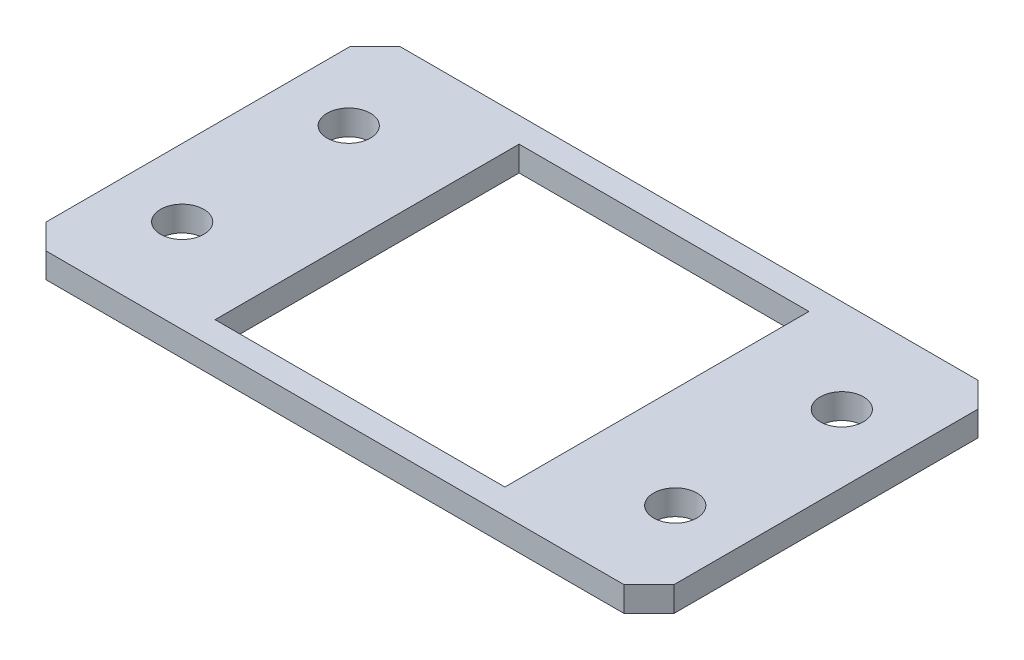
ISO-10303-21;
HEADER;
FILE_DESCRIPTION(('STEP AP214'),'2;1');
FILE_NAME('part.step','',(''),(''),'','','');
FILE_SCHEMA(('AUTOMOTIVE_DESIGN { 1 0 10303 214 1 1 1 1 }'));
ENDSEC;
DATA;
#1=APPLICATION_CONTEXT('core data for automotive mechanical design processes');
#2=APPLICATION_PROTOCOL_DEFINITION('international standard','automotive_design',2000,#1);
#3=PRODUCT_CONTEXT('',#1,'mechanical');
#4=PRODUCT('Part','Part','',(#3));
#5=PRODUCT_RELATED_PRODUCT_CATEGORY('part','',(#4));
#6=PRODUCT_DEFINITION_FORMATION('','',#4);
#7=PRODUCT_DEFINITION_CONTEXT('part definition',#1,'design');
#8=PRODUCT_DEFINITION('design','',#6,#7);
#9=PRODUCT_DEFINITION_SHAPE('','',#8);
#10=(LENGTH_UNIT() NAMED_UNIT(*) SI_UNIT(.MILLI.,.METRE.));
#11=(NAMED_UNIT(*) PLANE_ANGLE_UNIT() SI_UNIT($,.RADIAN.));
#12=(NAMED_UNIT(*) SI_UNIT($,.STERADIAN.) SOLID_ANGLE_UNIT());
#13=UNCERTAINTY_MEASURE_WITH_UNIT(LENGTH_MEASURE(1.E-05),#10,'distance_accuracy_value','');
#14=(GEOMETRIC_REPRESENTATION_CONTEXT(3) GLOBAL_UNCERTAINTY_ASSIGNED_CONTEXT((#13)) GLOBAL_UNIT_ASSIGNED_CONTEXT((#10,
#11,#12)) REPRESENTATION_CONTEXT('',''));
#15=CARTESIAN_POINT('',(0.,0.,0.));
#16=DIRECTION('',(0.,0.,1.));
#17=DIRECTION('',(1.,0.,0.));
#18=AXIS2_PLACEMENT_3D('',#15,#16,#17);
#19=CARTESIAN_POINT('',(0.,3.,18.4656202867812));
#20=DIRECTION('',(0.,0.,-1.));
#21=DIRECTION('',(-1.,0.,0.));
#22=AXIS2_PLACEMENT_3D('',#19,#20,#21);
#23=PLANE('',#22);
#24=DIRECTION('',(1.,0.,0.));
#25=VECTOR('',#24,1.);
#26=CARTESIAN_POINT('',(0.,0.,18.4656202867812));
#27=LINE('',#26,#25);
#28=CARTESIAN_POINT('',(-15.7752157261213,0.,18.4656202867812));
#29=VERTEX_POINT('',#28);
#30=CARTESIAN_POINT('',(19.0247842738787,0.,18.4656202867812));
#31=VERTEX_POINT('',#30);
#32=EDGE_CURVE('E144',#29,#31,#27,.T.);
#33=ORIENTED_EDGE('',*,*,#32,.F.);
#34=DIRECTION('',(0.,-1.,0.));
#35=VECTOR('',#34,1.);
#36=CARTESIAN_POINT('',(-15.7752157261213,3.,18.4656202867812));
#37=LINE('',#36,#35);
#38=CARTESIAN_POINT('',(-15.7752157261213,3.,18.4656202867812));
#39=VERTEX_POINT('',#38);
#40=EDGE_CURVE('E138',#39,#29,#37,.T.);
#41=ORIENTED_EDGE('',*,*,#40,.F.);
#42=DIRECTION('',(1.,0.,0.));
#43=VECTOR('',#42,1.);
#44=CARTESIAN_POINT('',(0.,3.,18.4656202867812));
#45=LINE('',#44,#43);
#46=CARTESIAN_POINT('',(19.0247842738787,3.,18.4656202867812));
#47=VERTEX_POINT('',#46);
#48=EDGE_CURVE('E141',#39,#47,#45,.T.);
#49=ORIENTED_EDGE('',*,*,#48,.T.);
#50=DIRECTION('',(0.,-1.,0.));
#51=VECTOR('',#50,1.);
#52=CARTESIAN_POINT('',(19.0247842738787,3.,18.4656202867812));
#53=LINE('',#52,#51);
#54=EDGE_CURVE('E176',#47,#31,#53,.T.);
#55=ORIENTED_EDGE('',*,*,#54,.T.);
#56=EDGE_LOOP('',(#33,#41,#49,#55));
#57=FACE_BOUND('',#56,.T.);
#58=ADVANCED_FACE('F46',(#57),#23,.T.);
#59=CARTESIAN_POINT('',(-15.7752157261213,3.,0.));
#60=DIRECTION('',(-1.,0.,0.));
#61=DIRECTION('',(0.,0.,1.));
#62=AXIS2_PLACEMENT_3D('',#59,#60,#61);
#63=PLANE('',#62);
#64=DIRECTION('',(0.,0.,-1.));
#65=VECTOR('',#64,1.);
#66=CARTESIAN_POINT('',(-15.7752157261213,0.,0.));
#67=LINE('',#66,#65);
#68=CARTESIAN_POINT('',(-15.7752157261213,0.,-18.0381411859944));
#69=VERTEX_POINT('',#68);
#70=EDGE_CURVE('E211',#29,#69,#67,.T.);
#71=ORIENTED_EDGE('',*,*,#70,.T.);
#72=DIRECTION('',(0.,-1.,0.));
#73=VECTOR('',#72,1.);
#74=CARTESIAN_POINT('',(-15.7752157261213,3.,-18.0381411859944));
#75=LINE('',#74,#73);
#76=CARTESIAN_POINT('',(-15.7752157261213,3.,-18.0381411859944));
#77=VERTEX_POINT('',#76);
#78=EDGE_CURVE('E150',#77,#69,#75,.T.);
#79=ORIENTED_EDGE('',*,*,#78,.F.);
#80=DIRECTION('',(0.,0.,-1.));
#81=VECTOR('',#80,1.);
#82=CARTESIAN_POINT('',(-15.7752157261213,3.,0.));
#83=LINE('',#82,#81);
#84=EDGE_CURVE('E154',#39,#77,#83,.T.);
#85=ORIENTED_EDGE('',*,*,#84,.F.);
#86=ORIENTED_EDGE('',*,*,#40,.T.);
#87=EDGE_LOOP('',(#71,#79,#85,#86));
#88=FACE_BOUND('',#87,.T.);
#89=ADVANCED_FACE('F155',(#88),#63,.F.);
#90=CARTESIAN_POINT('',(0.,3.,-18.0381411859944));
#91=DIRECTION('',(0.,0.,-1.));
#92=DIRECTION('',(-1.,0.,0.));
#93=AXIS2_PLACEMENT_3D('',#90,#91,#92);
#94=PLANE('',#93);
#95=DIRECTION('',(1.,0.,0.));
#96=VECTOR('',#95,1.);
#97=CARTESIAN_POINT('',(0.,0.,-18.0381411859944));
#98=LINE('',#97,#96);
#99=CARTESIAN_POINT('',(19.0247842738787,0.,-18.0381411859944));
#100=VERTEX_POINT('',#99);
#101=EDGE_CURVE('E214',#69,#100,#98,.T.);
#102=ORIENTED_EDGE('',*,*,#101,.T.);
#103=DIRECTION('',(0.,-1.,0.));
#104=VECTOR('',#103,1.);
#105=CARTESIAN_POINT('',(19.0247842738787,3.,-18.0381411859944));
#106=LINE('',#105,#104);
#107=CARTESIAN_POINT('',(19.0247842738787,3.,-18.0381411859944));
#108=VERTEX_POINT('',#107);
#109=EDGE_CURVE('E225',#108,#100,#106,.T.);
#110=ORIENTED_EDGE('',*,*,#109,.F.);
#111=DIRECTION('',(1.,0.,0.));
#112=VECTOR('',#111,1.);
#113=CARTESIAN_POINT('',(0.,3.,-18.0381411859944));
#114=LINE('',#113,#112);
#115=EDGE_CURVE('E159',#77,#108,#114,.T.);
#116=ORIENTED_EDGE('',*,*,#115,.F.);
#117=ORIENTED_EDGE('',*,*,#78,.T.);
#118=EDGE_LOOP('',(#102,#110,#116,#117));
#119=FACE_BOUND('',#118,.T.);
#120=ADVANCED_FACE('F362',(#119),#94,.F.);
#121=CARTESIAN_POINT('',(0.,3.,21.4656202867812));
#122=DIRECTION('',(0.,0.,-1.));
#123=DIRECTION('',(-1.,0.,0.));
#124=AXIS2_PLACEMENT_3D('',#121,#122,#123);
#125=PLANE('',#124);
#126=DIRECTION('',(1.,0.,0.));
#127=VECTOR('',#126,1.);
#128=CARTESIAN_POINT('',(0.,0.,21.4656202867812));
#129=LINE('',#128,#127);
#130=CARTESIAN_POINT('',(-33.0752157261213,0.,21.4656202867812));
#131=VERTEX_POINT('',#130);
#132=CARTESIAN_POINT('',(36.3247842738787,0.,21.4656202867812));
#133=VERTEX_POINT('',#132);
#134=EDGE_CURVE('E193',#131,#133,#129,.T.);
#135=ORIENTED_EDGE('',*,*,#134,.T.);
#136=DIRECTION('',(0.,1.,0.));
#137=VECTOR('',#136,1.);
#138=CARTESIAN_POINT('',(36.3247842738787,3.,21.4656202867812));
#139=LINE('',#138,#137);
#140=CARTESIAN_POINT('',(36.3247842738787,3.,21.4656202867812));
#141=VERTEX_POINT('',#140);
#142=EDGE_CURVE('E270',#133,#141,#139,.T.);
#143=ORIENTED_EDGE('',*,*,#142,.T.);
#144=DIRECTION('',(1.,0.,0.));
#145=VECTOR('',#144,1.);
#146=CARTESIAN_POINT('',(0.,3.,21.4656202867812));
#147=LINE('',#146,#145);
#148=CARTESIAN_POINT('',(-33.0752157261213,3.,21.4656202867812));
#149=VERTEX_POINT('',#148);
#150=EDGE_CURVE('E278',#149,#141,#147,.T.);
#151=ORIENTED_EDGE('',*,*,#150,.F.);
#152=DIRECTION('',(0.,-1.,0.));
#153=VECTOR('',#152,1.);
#154=CARTESIAN_POINT('',(-33.0752157261213,0.,21.4656202867812));
#155=LINE('',#154,#153);
#156=EDGE_CURVE('E266',#149,#131,#155,.T.);
#157=ORIENTED_EDGE('',*,*,#156,.T.);
#158=EDGE_LOOP('',(#135,#143,#151,#157));
#159=FACE_BOUND('',#158,.T.);
#160=ADVANCED_FACE('F277',(#159),#125,.F.);
#161=CARTESIAN_POINT('',(39.3247842738788,3.,0.));
#162=DIRECTION('',(-1.,0.,0.));
#163=DIRECTION('',(0.,0.,1.));
#164=AXIS2_PLACEMENT_3D('',#161,#162,#163);
#165=PLANE('',#164);
#166=DIRECTION('',(0.,0.,-1.));
#167=VECTOR('',#166,1.);
#168=CARTESIAN_POINT('',(39.3247842738788,0.,0.));
#169=LINE('',#168,#167);
#170=CARTESIAN_POINT('',(39.3247842738788,0.,18.4656202867812));
#171=VERTEX_POINT('',#170);
#172=CARTESIAN_POINT('',(39.3247842738788,0.,-18.0381411859944));
#173=VERTEX_POINT('',#172);
#174=EDGE_CURVE('E197',#171,#173,#169,.T.);
#175=ORIENTED_EDGE('',*,*,#174,.T.);
#176=DIRECTION('',(0.,1.,0.));
#177=VECTOR('',#176,1.);
#178=CARTESIAN_POINT('',(39.3247842738788,3.,-18.0381411859944));
#179=LINE('',#178,#177);
#180=CARTESIAN_POINT('',(39.3247842738788,3.,-18.0381411859944));
#181=VERTEX_POINT('',#180);
#182=EDGE_CURVE('E252',#173,#181,#179,.T.);
#183=ORIENTED_EDGE('',*,*,#182,.T.);
#184=DIRECTION('',(0.,0.,-1.));
#185=VECTOR('',#184,1.);
#186=CARTESIAN_POINT('',(39.3247842738788,3.,0.));
#187=LINE('',#186,#185);
#188=CARTESIAN_POINT('',(39.3247842738788,3.,18.4656202867812));
#189=VERTEX_POINT('',#188);
#190=EDGE_CURVE('E287',#189,#181,#187,.T.);
#191=ORIENTED_EDGE('',*,*,#190,.F.);
#192=DIRECTION('',(0.,-1.,0.));
#193=VECTOR('',#192,1.);
#194=CARTESIAN_POINT('',(39.3247842738788,3.,18.4656202867812));
#195=LINE('',#194,#193);
#196=EDGE_CURVE('E248',#189,#171,#195,.T.);
#197=ORIENTED_EDGE('',*,*,#196,.T.);
#198=EDGE_LOOP('',(#175,#183,#191,#197));
#199=FACE_BOUND('',#198,.T.);
#200=ADVANCED_FACE('F294',(#199),#165,.F.);
#201=CARTESIAN_POINT('',(0.,3.,-21.0381411859944));
#202=DIRECTION('',(0.,0.,-1.));
#203=DIRECTION('',(-1.,0.,0.));
#204=AXIS2_PLACEMENT_3D('',#201,#202,#203);
#205=PLANE('',#204);
#206=DIRECTION('',(1.,0.,0.));
#207=VECTOR('',#206,1.);
#208=CARTESIAN_POINT('',(0.,3.,-21.0381411859944));
#209=LINE('',#208,#207);
#210=CARTESIAN_POINT('',(-33.0752157261212,3.,-21.0381411859944));
#211=VERTEX_POINT('',#210);
#212=CARTESIAN_POINT('',(36.3247842738787,3.,-21.0381411859944));
#213=VERTEX_POINT('',#212);
#214=EDGE_CURVE('E168',#211,#213,#209,.T.);
#215=ORIENTED_EDGE('',*,*,#214,.T.);
#216=DIRECTION('',(0.,-1.,0.));
#217=VECTOR('',#216,1.);
#218=CARTESIAN_POINT('',(36.3247842738787,0.,-21.0381411859944));
#219=LINE('',#218,#217);
#220=CARTESIAN_POINT('',(36.3247842738787,0.,-21.0381411859944));
#221=VERTEX_POINT('',#220);
#222=EDGE_CURVE('E232',#213,#221,#219,.T.);
#223=ORIENTED_EDGE('',*,*,#222,.T.);
#224=DIRECTION('',(1.,0.,0.));
#225=VECTOR('',#224,1.);
#226=CARTESIAN_POINT('',(0.,0.,-21.0381411859944));
#227=LINE('',#226,#225);
#228=CARTESIAN_POINT('',(-33.0752157261212,0.,-21.0381411859944));
#229=VERTEX_POINT('',#228);
#230=EDGE_CURVE('E201',#229,#221,#227,.T.);
#231=ORIENTED_EDGE('',*,*,#230,.F.);
#232=DIRECTION('',(0.,1.,0.));
#233=VECTOR('',#232,1.);
#234=CARTESIAN_POINT('',(-33.0752157261212,3.,-21.0381411859944));
#235=LINE('',#234,#233);
#236=EDGE_CURVE('E149',#229,#211,#235,.T.);
#237=ORIENTED_EDGE('',*,*,#236,.T.);
#238=EDGE_LOOP('',(#215,#223,#231,#237));
#239=FACE_BOUND('',#238,.T.);
#240=ADVANCED_FACE('F306',(#239),#205,.T.);
#241=CARTESIAN_POINT('',(-36.0752157261213,3.,0.));
#242=DIRECTION('',(-1.,0.,0.));
#243=DIRECTION('',(0.,0.,1.));
#244=AXIS2_PLACEMENT_3D('',#241,#242,#243);
#245=PLANE('',#244);
#246=DIRECTION('',(0.,0.,-1.));
#247=VECTOR('',#246,1.);
#248=CARTESIAN_POINT('',(-36.0752157261213,3.,0.));
#249=LINE('',#248,#247);
#250=CARTESIAN_POINT('',(-36.0752157261213,3.,18.4656202867812));
#251=VERTEX_POINT('',#250);
#252=CARTESIAN_POINT('',(-36.0752157261213,3.,-18.0381411859944));
#253=VERTEX_POINT('',#252);
#254=EDGE_CURVE('E165',#251,#253,#249,.T.);
#255=ORIENTED_EDGE('',*,*,#254,.T.);
#256=DIRECTION('',(0.,-1.,0.));
#257=VECTOR('',#256,1.);
#258=CARTESIAN_POINT('',(-36.0752157261213,3.,-18.0381411859944));
#259=LINE('',#258,#257);
#260=CARTESIAN_POINT('',(-36.0752157261213,0.,-18.0381411859944));
#261=VERTEX_POINT('',#260);
#262=EDGE_CURVE('E11',#253,#261,#259,.T.);
#263=ORIENTED_EDGE('',*,*,#262,.T.);
#264=DIRECTION('',(0.,0.,-1.));
#265=VECTOR('',#264,1.);
#266=CARTESIAN_POINT('',(-36.0752157261213,0.,0.));
#267=LINE('',#266,#265);
#268=CARTESIAN_POINT('',(-36.0752157261213,0.,18.4656202867812));
#269=VERTEX_POINT('',#268);
#270=EDGE_CURVE('E205',#269,#261,#267,.T.);
#271=ORIENTED_EDGE('',*,*,#270,.F.);
#272=DIRECTION('',(0.,1.,0.));
#273=VECTOR('',#272,1.);
#274=CARTESIAN_POINT('',(-36.0752157261213,3.,18.4656202867812));
#275=LINE('',#274,#273);
#276=EDGE_CURVE('E56',#269,#251,#275,.T.);
#277=ORIENTED_EDGE('',*,*,#276,.T.);
#278=EDGE_LOOP('',(#255,#263,#271,#277));
#279=FACE_BOUND('',#278,.T.);
#280=ADVANCED_FACE('F344',(#279),#245,.T.);
#281=CARTESIAN_POINT('',(-27.9252157261213,3.,-9.73437971321876));
#282=DIRECTION('',(0.,-1.,0.));
#283=DIRECTION('',(0.,0.,-1.));
#284=AXIS2_PLACEMENT_3D('',#281,#282,#283);
#285=CYLINDRICAL_SURFACE('',#284,2.6);
#286=CARTESIAN_POINT('',(-27.9252157261213,3.,-9.73437971321876));
#287=DIRECTION('',(0.,1.,0.));
#288=DIRECTION('',(0.,0.,1.));
#289=AXIS2_PLACEMENT_3D('',#286,#287,#288);
#290=CIRCLE('',#289,2.6);
#291=CARTESIAN_POINT('',(-27.9252157261213,3.,-7.13437971321876));
#292=VERTEX_POINT('',#291);
#293=EDGE_CURVE('E288',#292,#292,#290,.T.);
#294=ORIENTED_EDGE('',*,*,#293,.T.);
#295=EDGE_LOOP('',(#294));
#296=FACE_BOUND('',#295,.T.);
#297=CARTESIAN_POINT('',(-27.9252157261213,0.,-9.73437971321876));
#298=DIRECTION('',(0.,1.,0.));
#299=DIRECTION('',(0.,0.,1.));
#300=AXIS2_PLACEMENT_3D('',#297,#298,#299);
#301=CIRCLE('',#300,2.6);
#302=CARTESIAN_POINT('',(-27.9252157261213,0.,-7.13437971321876));
#303=VERTEX_POINT('',#302);
#304=EDGE_CURVE('E189',#303,#303,#301,.T.);
#305=ORIENTED_EDGE('',*,*,#304,.F.);
#306=EDGE_LOOP('',(#305));
#307=FACE_BOUND('',#306,.T.);
#308=ADVANCED_FACE('F340',(#296,#307),#285,.F.);
#309=CARTESIAN_POINT('',(-27.9252157261213,3.,10.2656202867812));
#310=DIRECTION('',(0.,-1.,0.));
#311=DIRECTION('',(0.,0.,-1.));
#312=AXIS2_PLACEMENT_3D('',#309,#310,#311);
#313=CYLINDRICAL_SURFACE('',#312,2.59999999999999);
#314=CARTESIAN_POINT('',(-27.9252157261213,3.,10.2656202867812));
#315=DIRECTION('',(0.,1.,0.));
#316=DIRECTION('',(0.,0.,1.));
#317=AXIS2_PLACEMENT_3D('',#314,#315,#316);
#318=CIRCLE('',#317,2.59999999999999);
#319=CARTESIAN_POINT('',(-27.9252157261213,3.,12.8656202867812));
#320=VERTEX_POINT('',#319);
#321=EDGE_CURVE('E315',#320,#320,#318,.T.);
#322=ORIENTED_EDGE('',*,*,#321,.T.);
#323=EDGE_LOOP('',(#322));
#324=FACE_BOUND('',#323,.T.);
#325=CARTESIAN_POINT('',(-27.9252157261213,0.,10.2656202867812));
#326=DIRECTION('',(0.,1.,0.));
#327=DIRECTION('',(0.,0.,1.));
#328=AXIS2_PLACEMENT_3D('',#325,#326,#327);
#329=CIRCLE('',#328,2.59999999999999);
#330=CARTESIAN_POINT('',(-27.9252157261213,0.,12.8656202867812));
#331=VERTEX_POINT('',#330);
#332=EDGE_CURVE('E185',#331,#331,#329,.T.);
#333=ORIENTED_EDGE('',*,*,#332,.F.);
#334=EDGE_LOOP('',(#333));
#335=FACE_BOUND('',#334,.T.);
#336=ADVANCED_FACE('F343',(#324,#335),#313,.F.);
#337=CARTESIAN_POINT('',(31.1747842738788,3.,-9.83814118599444));
#338=DIRECTION('',(0.,-1.,0.));
#339=DIRECTION('',(0.,0.,-1.));
#340=AXIS2_PLACEMENT_3D('',#337,#338,#339);
#341=CYLINDRICAL_SURFACE('',#340,2.60000000000002);
#342=CARTESIAN_POINT('',(31.1747842738788,3.,-9.83814118599444));
#343=DIRECTION('',(0.,1.,0.));
#344=DIRECTION('',(0.,0.,1.));
#345=AXIS2_PLACEMENT_3D('',#342,#343,#344);
#346=CIRCLE('',#345,2.60000000000002);
#347=CARTESIAN_POINT('',(31.1747842738788,3.,-7.23814118599442));
#348=VERTEX_POINT('',#347);
#349=EDGE_CURVE('E319',#348,#348,#346,.T.);
#350=ORIENTED_EDGE('',*,*,#349,.T.);
#351=EDGE_LOOP('',(#350));
#352=FACE_BOUND('',#351,.T.);
#353=CARTESIAN_POINT('',(31.1747842738788,0.,-9.83814118599444));
#354=DIRECTION('',(0.,1.,0.));
#355=DIRECTION('',(0.,0.,1.));
#356=AXIS2_PLACEMENT_3D('',#353,#354,#355);
#357=CIRCLE('',#356,2.60000000000002);
#358=CARTESIAN_POINT('',(31.1747842738788,0.,-7.23814118599442));
#359=VERTEX_POINT('',#358);
#360=EDGE_CURVE('E181',#359,#359,#357,.T.);
#361=ORIENTED_EDGE('',*,*,#360,.F.);
#362=EDGE_LOOP('',(#361));
#363=FACE_BOUND('',#362,.T.);
#364=ADVANCED_FACE('F376',(#352,#363),#341,.F.);
#365=CARTESIAN_POINT('',(31.1747842738788,3.,10.1618588140056));
#366=DIRECTION('',(0.,-1.,0.));
#367=DIRECTION('',(0.,0.,-1.));
#368=AXIS2_PLACEMENT_3D('',#365,#366,#367);
#369=CYLINDRICAL_SURFACE('',#368,2.59999999999999);
#370=CARTESIAN_POINT('',(31.1747842738788,3.,10.1618588140056));
#371=DIRECTION('',(0.,1.,0.));
#372=DIRECTION('',(0.,0.,1.));
#373=AXIS2_PLACEMENT_3D('',#370,#371,#372);
#374=CIRCLE('',#373,2.59999999999999);
#375=CARTESIAN_POINT('',(31.1747842738788,3.,12.7618588140056));
#376=VERTEX_POINT('',#375);
#377=EDGE_CURVE('E222',#376,#376,#374,.T.);
#378=ORIENTED_EDGE('',*,*,#377,.T.);
#379=EDGE_LOOP('',(#378));
#380=FACE_BOUND('',#379,.T.);
#381=CARTESIAN_POINT('',(31.1747842738788,0.,10.1618588140056));
#382=DIRECTION('',(0.,1.,0.));
#383=DIRECTION('',(0.,0.,1.));
#384=AXIS2_PLACEMENT_3D('',#381,#382,#383);
#385=CIRCLE('',#384,2.59999999999999);
#386=CARTESIAN_POINT('',(31.1747842738788,0.,12.7618588140056));
#387=VERTEX_POINT('',#386);
#388=EDGE_CURVE('E177',#387,#387,#385,.T.);
#389=ORIENTED_EDGE('',*,*,#388,.F.);
#390=EDGE_LOOP('',(#389));
#391=FACE_BOUND('',#390,.T.);
#392=ADVANCED_FACE('F327',(#380,#391),#369,.F.);
#393=CARTESIAN_POINT('',(19.0247842738787,3.,0.));
#394=DIRECTION('',(-1.,0.,0.));
#395=DIRECTION('',(0.,0.,1.));
#396=AXIS2_PLACEMENT_3D('',#393,#394,#395);
#397=PLANE('',#396);
#398=DIRECTION('',(0.,0.,-1.));
#399=VECTOR('',#398,1.);
#400=CARTESIAN_POINT('',(19.0247842738787,0.,0.));
#401=LINE('',#400,#399);
#402=EDGE_CURVE('E218',#31,#100,#401,.T.);
#403=ORIENTED_EDGE('',*,*,#402,.F.);
#404=ORIENTED_EDGE('',*,*,#54,.F.);
#405=DIRECTION('',(0.,0.,-1.));
#406=VECTOR('',#405,1.);
#407=CARTESIAN_POINT('',(19.0247842738787,3.,0.));
#408=LINE('',#407,#406);
#409=EDGE_CURVE('E163',#47,#108,#408,.T.);
#410=ORIENTED_EDGE('',*,*,#409,.T.);
#411=ORIENTED_EDGE('',*,*,#109,.T.);
#412=EDGE_LOOP('',(#403,#404,#410,#411));
#413=FACE_BOUND('',#412,.T.);
#414=ADVANCED_FACE('F332',(#413),#397,.T.);
#415=CARTESIAN_POINT('',(0.,3.,0.));
#416=DIRECTION('',(0.,1.,0.));
#417=DIRECTION('',(0.,0.,1.));
#418=AXIS2_PLACEMENT_3D('',#415,#416,#417);
#419=PLANE('',#418);
#420=ORIENTED_EDGE('',*,*,#377,.F.);
#421=EDGE_LOOP('',(#420));
#422=FACE_BOUND('',#421,.T.);
#423=ORIENTED_EDGE('',*,*,#349,.F.);
#424=EDGE_LOOP('',(#423));
#425=FACE_BOUND('',#424,.T.);
#426=ORIENTED_EDGE('',*,*,#321,.F.);
#427=EDGE_LOOP('',(#426));
#428=FACE_BOUND('',#427,.T.);
#429=ORIENTED_EDGE('',*,*,#293,.F.);
#430=EDGE_LOOP('',(#429));
#431=FACE_BOUND('',#430,.T.);
#432=ORIENTED_EDGE('',*,*,#190,.T.);
#433=DIRECTION('',(-0.707106781186545,0.,-0.70710678118655));
#434=VECTOR('',#433,1.);
#435=CARTESIAN_POINT('',(28.6814627299367,3.,-28.6814627299365));
#436=LINE('',#435,#434);
#437=EDGE_CURVE('E263',#181,#213,#436,.T.);
#438=ORIENTED_EDGE('',*,*,#437,.T.);
#439=ORIENTED_EDGE('',*,*,#214,.F.);
#440=DIRECTION('',(0.707106781186549,0.,-0.707106781186546));
#441=VECTOR('',#440,1.);
#442=CARTESIAN_POINT('',(-27.0566784560577,3.,-27.0566784560579));
#443=LINE('',#442,#441);
#444=EDGE_CURVE('E63',#211,#253,#443,.F.);
#445=ORIENTED_EDGE('',*,*,#444,.T.);
#446=ORIENTED_EDGE('',*,*,#254,.F.);
#447=DIRECTION('',(0.707106781186545,0.,0.70710678118655));
#448=VECTOR('',#447,1.);
#449=CARTESIAN_POINT('',(-27.2704180064514,3.,27.2704180064512));
#450=LINE('',#449,#448);
#451=EDGE_CURVE('E255',#251,#149,#450,.T.);
#452=ORIENTED_EDGE('',*,*,#451,.T.);
#453=ORIENTED_EDGE('',*,*,#150,.T.);
#454=DIRECTION('',(-0.707106781186549,0.,0.707106781186546));
#455=VECTOR('',#454,1.);
#456=CARTESIAN_POINT('',(28.8952022803299,3.,28.89520228033));
#457=LINE('',#456,#455);
#458=EDGE_CURVE('E260',#141,#189,#457,.F.);
#459=ORIENTED_EDGE('',*,*,#458,.T.);
#460=EDGE_LOOP('',(#432,#438,#439,#445,#446,#452,#453,#459));
#461=FACE_BOUND('',#460,.T.);
#462=ORIENTED_EDGE('',*,*,#48,.F.);
#463=ORIENTED_EDGE('',*,*,#84,.T.);
#464=ORIENTED_EDGE('',*,*,#115,.T.);
#465=ORIENTED_EDGE('',*,*,#409,.F.);
#466=EDGE_LOOP('',(#462,#463,#464,#465));
#467=FACE_BOUND('',#466,.T.);
#468=ADVANCED_FACE('F161',(#422,#425,#428,#431,#461,#467),#419,.T.);
#469=CARTESIAN_POINT('',(0.,0.,0.));
#470=DIRECTION('',(0.,1.,0.));
#471=DIRECTION('',(0.,0.,1.));
#472=AXIS2_PLACEMENT_3D('',#469,#470,#471);
#473=PLANE('',#472);
#474=ORIENTED_EDGE('',*,*,#388,.T.);
#475=EDGE_LOOP('',(#474));
#476=FACE_BOUND('',#475,.T.);
#477=ORIENTED_EDGE('',*,*,#360,.T.);
#478=EDGE_LOOP('',(#477));
#479=FACE_BOUND('',#478,.T.);
#480=ORIENTED_EDGE('',*,*,#332,.T.);
#481=EDGE_LOOP('',(#480));
#482=FACE_BOUND('',#481,.T.);
#483=ORIENTED_EDGE('',*,*,#304,.T.);
#484=EDGE_LOOP('',(#483));
#485=FACE_BOUND('',#484,.T.);
#486=ORIENTED_EDGE('',*,*,#230,.T.);
#487=DIRECTION('',(0.707106781186545,0.,0.70710678118655));
#488=VECTOR('',#487,1.);
#489=CARTESIAN_POINT('',(36.3247842738787,0.,-21.0381411859944));
#490=LINE('',#489,#488);
#491=EDGE_CURVE('E245',#221,#173,#490,.T.);
#492=ORIENTED_EDGE('',*,*,#491,.T.);
#493=ORIENTED_EDGE('',*,*,#174,.F.);
#494=DIRECTION('',(0.707106781186549,0.,-0.707106781186546));
#495=VECTOR('',#494,1.);
#496=CARTESIAN_POINT('',(39.3247842738788,0.,18.4656202867812));
#497=LINE('',#496,#495);
#498=EDGE_CURVE('E242',#171,#133,#497,.F.);
#499=ORIENTED_EDGE('',*,*,#498,.T.);
#500=ORIENTED_EDGE('',*,*,#134,.F.);
#501=DIRECTION('',(-0.707106781186545,0.,-0.70710678118655));
#502=VECTOR('',#501,1.);
#503=CARTESIAN_POINT('',(-33.0752157261213,0.,21.4656202867812));
#504=LINE('',#503,#502);
#505=EDGE_CURVE('E236',#131,#269,#504,.T.);
#506=ORIENTED_EDGE('',*,*,#505,.T.);
#507=ORIENTED_EDGE('',*,*,#270,.T.);
#508=DIRECTION('',(-0.707106781186549,0.,0.707106781186546));
#509=VECTOR('',#508,1.);
#510=CARTESIAN_POINT('',(-36.0752157261213,0.,-18.0381411859944));
#511=LINE('',#510,#509);
#512=EDGE_CURVE('E239',#261,#229,#511,.F.);
#513=ORIENTED_EDGE('',*,*,#512,.T.);
#514=EDGE_LOOP('',(#486,#492,#493,#499,#500,#506,#507,#513));
#515=FACE_BOUND('',#514,.T.);
#516=ORIENTED_EDGE('',*,*,#32,.T.);
#517=ORIENTED_EDGE('',*,*,#402,.T.);
#518=ORIENTED_EDGE('',*,*,#101,.F.);
#519=ORIENTED_EDGE('',*,*,#70,.F.);
#520=EDGE_LOOP('',(#516,#517,#518,#519));
#521=FACE_BOUND('',#520,.T.);
#522=ADVANCED_FACE('F297',(#476,#479,#482,#485,#515,#521),#473,.F.);
#523=CARTESIAN_POINT('',(36.3247842738787,3.,-21.0381411859944));
#524=DIRECTION('',(0.70710678118655,0.,-0.707106781186545));
#525=DIRECTION('',(0.,1.,0.));
#526=AXIS2_PLACEMENT_3D('',#523,#524,#525);
#527=PLANE('',#526);
#528=ORIENTED_EDGE('',*,*,#437,.F.);
#529=ORIENTED_EDGE('',*,*,#182,.F.);
#530=ORIENTED_EDGE('',*,*,#491,.F.);
#531=ORIENTED_EDGE('',*,*,#222,.F.);
#532=EDGE_LOOP('',(#528,#529,#530,#531));
#533=FACE_BOUND('',#532,.T.);
#534=ADVANCED_FACE('F303',(#533),#527,.T.);
#535=CARTESIAN_POINT('',(39.3247842738788,3.,18.4656202867812));
#536=DIRECTION('',(-0.707106781186546,0.,-0.707106781186549));
#537=DIRECTION('',(0.,-1.,0.));
#538=AXIS2_PLACEMENT_3D('',#535,#536,#537);
#539=PLANE('',#538);
#540=ORIENTED_EDGE('',*,*,#458,.F.);
#541=ORIENTED_EDGE('',*,*,#142,.F.);
#542=ORIENTED_EDGE('',*,*,#498,.F.);
#543=ORIENTED_EDGE('',*,*,#196,.F.);
#544=EDGE_LOOP('',(#540,#541,#542,#543));
#545=FACE_BOUND('',#544,.T.);
#546=ADVANCED_FACE('F291',(#545),#539,.F.);
#547=CARTESIAN_POINT('',(-36.0752157261213,3.,-18.0381411859944));
#548=DIRECTION('',(0.707106781186546,0.,0.707106781186549));
#549=DIRECTION('',(0.,-1.,0.));
#550=AXIS2_PLACEMENT_3D('',#547,#548,#549);
#551=PLANE('',#550);
#552=ORIENTED_EDGE('',*,*,#444,.F.);
#553=ORIENTED_EDGE('',*,*,#236,.F.);
#554=ORIENTED_EDGE('',*,*,#512,.F.);
#555=ORIENTED_EDGE('',*,*,#262,.F.);
#556=EDGE_LOOP('',(#552,#553,#554,#555));
#557=FACE_BOUND('',#556,.T.);
#558=ADVANCED_FACE('F391',(#557),#551,.F.);
#559=CARTESIAN_POINT('',(-33.0752157261213,3.,21.4656202867812));
#560=DIRECTION('',(-0.70710678118655,0.,0.707106781186545));
#561=DIRECTION('',(0.,1.,0.));
#562=AXIS2_PLACEMENT_3D('',#559,#560,#561);
#563=PLANE('',#562);
#564=ORIENTED_EDGE('',*,*,#451,.F.);
#565=ORIENTED_EDGE('',*,*,#276,.F.);
#566=ORIENTED_EDGE('',*,*,#505,.F.);
#567=ORIENTED_EDGE('',*,*,#156,.F.);
#568=EDGE_LOOP('',(#564,#565,#566,#567));
#569=FACE_BOUND('',#568,.T.);
#570=ADVANCED_FACE('F49',(#569),#563,.T.);
#571=CLOSED_SHELL('',(#58,#89,#120,#160,#200,#240,#280,#308,#336,#364,#392,#414,#468,#522,#534,
#546,#558,#570));
#572=MANIFOLD_SOLID_BREP('B2',#571);
#573=ADVANCED_BREP_SHAPE_REPRESENTATION('',(#18,#572),#14);
#574=SHAPE_DEFINITION_REPRESENTATION(#9,#573);
ENDSEC;
END-ISO-10303-21;
